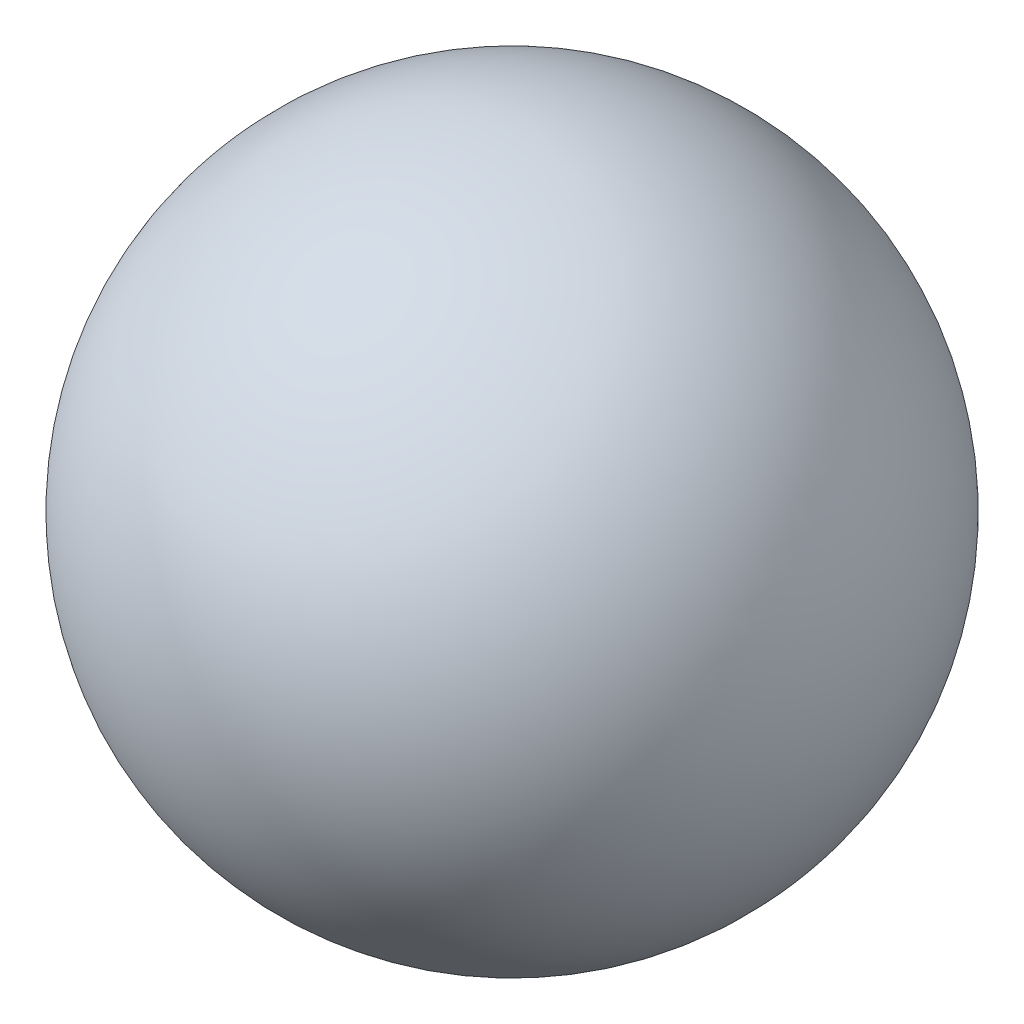
ISO-10303-21;
HEADER;
FILE_DESCRIPTION(('STEP AP214'),'2;1');
FILE_NAME('part.step','',(''),(''),'','','');
FILE_SCHEMA(('AUTOMOTIVE_DESIGN { 1 0 10303 214 1 1 1 1 }'));
ENDSEC;
DATA;
#1=APPLICATION_CONTEXT('core data for automotive mechanical design processes');
#2=APPLICATION_PROTOCOL_DEFINITION('international standard','automotive_design',2000,#1);
#3=PRODUCT_CONTEXT('',#1,'mechanical');
#4=PRODUCT('Part','Part','',(#3));
#5=PRODUCT_RELATED_PRODUCT_CATEGORY('part','',(#4));
#6=PRODUCT_DEFINITION_FORMATION('','',#4);
#7=PRODUCT_DEFINITION_CONTEXT('part definition',#1,'design');
#8=PRODUCT_DEFINITION('design','',#6,#7);
#9=PRODUCT_DEFINITION_SHAPE('','',#8);
#10=(LENGTH_UNIT() NAMED_UNIT(*) SI_UNIT(.MILLI.,.METRE.));
#11=(NAMED_UNIT(*) PLANE_ANGLE_UNIT() SI_UNIT($,.RADIAN.));
#12=(NAMED_UNIT(*) SI_UNIT($,.STERADIAN.) SOLID_ANGLE_UNIT());
#13=UNCERTAINTY_MEASURE_WITH_UNIT(LENGTH_MEASURE(1.E-05),#10,'distance_accuracy_value','');
#14=(GEOMETRIC_REPRESENTATION_CONTEXT(3) GLOBAL_UNCERTAINTY_ASSIGNED_CONTEXT((#13)) GLOBAL_UNIT_ASSIGNED_CONTEXT((#10,
#11,#12)) REPRESENTATION_CONTEXT('',''));
#15=CARTESIAN_POINT('',(0.,0.,0.));
#16=DIRECTION('',(0.,0.,1.));
#17=DIRECTION('',(1.,0.,0.));
#18=AXIS2_PLACEMENT_3D('',#15,#16,#17);
#19=CARTESIAN_POINT('',(3.43703832126948,-1.98437500000002,0.));
#20=DIRECTION('',(0.866025403784436,-0.500000000000004,0.));
#21=DIRECTION('',(0.500000000000004,0.866025403784436,0.));
#22=AXIS2_PLACEMENT_3D('',#19,#20,#21);
#23=SPHERICAL_SURFACE('',#22,0.758760243513405);
#24=CARTESIAN_POINT('',(4.09414396753376,-2.36375512175672,0.));
#25=VERTEX_POINT('',#24);
#26=VERTEX_LOOP('',#25);
#27=FACE_BOUND('',#26,.T.);
#28=ADVANCED_FACE('F34',(#27),#23,.T.);
#29=CLOSED_SHELL('',(#28));
#30=MANIFOLD_SOLID_BREP('B2',#29);
#31=ADVANCED_BREP_SHAPE_REPRESENTATION('',(#18,#30),#14);
#32=SHAPE_DEFINITION_REPRESENTATION(#9,#31);
ENDSEC;
END-ISO-10303-21;
